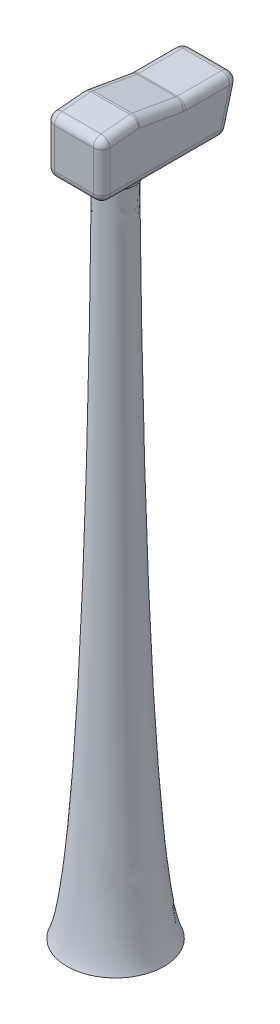
ISO-10303-21;
HEADER;
FILE_DESCRIPTION(('STEP AP214'),'2;1');
FILE_NAME('part.step','',(''),(''),'','','');
FILE_SCHEMA(('AUTOMOTIVE_DESIGN { 1 0 10303 214 1 1 1 1 }'));
ENDSEC;
DATA;
#1=APPLICATION_CONTEXT('core data for automotive mechanical design processes');
#2=APPLICATION_PROTOCOL_DEFINITION('international standard','automotive_design',2000,#1);
#3=PRODUCT_CONTEXT('',#1,'mechanical');
#4=PRODUCT('Part','Part','',(#3));
#5=PRODUCT_RELATED_PRODUCT_CATEGORY('part','',(#4));
#6=PRODUCT_DEFINITION_FORMATION('','',#4);
#7=PRODUCT_DEFINITION_CONTEXT('part definition',#1,'design');
#8=PRODUCT_DEFINITION('design','',#6,#7);
#9=PRODUCT_DEFINITION_SHAPE('','',#8);
#10=(LENGTH_UNIT() NAMED_UNIT(*) SI_UNIT(.MILLI.,.METRE.));
#11=(NAMED_UNIT(*) PLANE_ANGLE_UNIT() SI_UNIT($,.RADIAN.));
#12=(NAMED_UNIT(*) SI_UNIT($,.STERADIAN.) SOLID_ANGLE_UNIT());
#13=UNCERTAINTY_MEASURE_WITH_UNIT(LENGTH_MEASURE(1.E-05),#10,'distance_accuracy_value','');
#14=(GEOMETRIC_REPRESENTATION_CONTEXT(3) GLOBAL_UNCERTAINTY_ASSIGNED_CONTEXT((#13)) GLOBAL_UNIT_ASSIGNED_CONTEXT((#10,
#11,#12)) REPRESENTATION_CONTEXT('',''));
#15=CARTESIAN_POINT('',(0.,0.,0.));
#16=DIRECTION('',(0.,0.,1.));
#17=DIRECTION('',(1.,0.,0.));
#18=AXIS2_PLACEMENT_3D('',#15,#16,#17);
#19=CARTESIAN_POINT('',(-4000.,-4000.,-21041.644905921));
#20=DIRECTION('',(0.,1.,0.));
#21=DIRECTION('',(0.,0.,1.));
#22=AXIS2_PLACEMENT_3D('',#19,#20,#21);
#23=PLANE('',#22);
#24=DIRECTION('',(0.,0.,1.));
#25=VECTOR('',#24,1.);
#26=CARTESIAN_POINT('',(2800.,-4000.,-3000.));
#27=LINE('',#26,#25);
#28=CARTESIAN_POINT('',(2800.,-4000.,-20120.8525203462));
#29=VERTEX_POINT('',#28);
#30=CARTESIAN_POINT('',(2800.,-4000.,-9000.));
#31=VERTEX_POINT('',#30);
#32=EDGE_CURVE('E187',#29,#31,#27,.T.);
#33=ORIENTED_EDGE('',*,*,#32,.T.);
#34=CARTESIAN_POINT('',(0.,-4000.,-9000.));
#35=DIRECTION('',(0.,1.,0.));
#36=DIRECTION('',(0.,0.,1.));
#37=AXIS2_PLACEMENT_3D('',#34,#35,#36);
#38=CIRCLE('',#37,2800.);
#39=CARTESIAN_POINT('',(-2800.,-4000.,-9000.));
#40=VERTEX_POINT('',#39);
#41=EDGE_CURVE('E54',#31,#40,#38,.T.);
#42=ORIENTED_EDGE('',*,*,#41,.T.);
#43=DIRECTION('',(0.,0.,1.));
#44=VECTOR('',#43,1.);
#45=CARTESIAN_POINT('',(-2800.,-4000.,-21041.644905921));
#46=LINE('',#45,#44);
#47=CARTESIAN_POINT('',(-2800.,-4000.,-20120.8525203462));
#48=VERTEX_POINT('',#47);
#49=EDGE_CURVE('E184',#40,#48,#46,.F.);
#50=ORIENTED_EDGE('',*,*,#49,.T.);
#51=DIRECTION('',(1.,0.,0.));
#52=VECTOR('',#51,1.);
#53=CARTESIAN_POINT('',(-4000.,-4000.,-20120.8525203462));
#54=LINE('',#53,#52);
#55=EDGE_CURVE('E201',#48,#29,#54,.T.);
#56=ORIENTED_EDGE('',*,*,#55,.T.);
#57=EDGE_LOOP('',(#33,#42,#50,#56));
#58=FACE_BOUND('',#57,.T.);
#59=ADVANCED_FACE('F37',(#58),#23,.F.);
#60=CARTESIAN_POINT('',(-2800.,-4000.,-4200.));
#61=VERTEX_POINT('',#60);
#62=EDGE_CURVE('E195',#61,#40,#46,.F.);
#63=ORIENTED_EDGE('',*,*,#62,.T.);
#64=EDGE_CURVE('E173',#40,#31,#38,.T.);
#65=ORIENTED_EDGE('',*,*,#64,.T.);
#66=CARTESIAN_POINT('',(2800.,-4000.,-4200.));
#67=VERTEX_POINT('',#66);
#68=EDGE_CURVE('E460',#31,#67,#27,.T.);
#69=ORIENTED_EDGE('',*,*,#68,.T.);
#70=DIRECTION('',(1.,0.,0.));
#71=VECTOR('',#70,1.);
#72=CARTESIAN_POINT('',(-4000.,-4000.,-4200.));
#73=LINE('',#72,#71);
#74=EDGE_CURVE('E205',#67,#61,#73,.F.);
#75=ORIENTED_EDGE('',*,*,#74,.T.);
#76=EDGE_LOOP('',(#63,#65,#69,#75));
#77=FACE_BOUND('',#76,.T.);
#78=ADVANCED_FACE('F203',(#77),#23,.F.);
#79=CARTESIAN_POINT('',(-4000.,4000.,-3000.));
#80=DIRECTION('',(0.,-0.996194698091746,-0.0871557427476548));
#81=DIRECTION('',(0.,0.0871557427476548,-0.996194698091746));
#82=AXIS2_PLACEMENT_3D('',#79,#80,#81);
#83=PLANE('',#82);
#84=DIRECTION('',(1.,0.,0.));
#85=VECTOR('',#84,1.);
#86=CARTESIAN_POINT('',(-4000.,4458.66965758579,-8242.61817589548));
#87=LINE('',#86,#85);
#88=CARTESIAN_POINT('',(2800.,4458.66965758579,-8242.61817589548));
#89=VERTEX_POINT('',#88);
#90=CARTESIAN_POINT('',(-2800.,4458.66965758579,-8242.61817589548));
#91=VERTEX_POINT('',#90);
#92=EDGE_CURVE('E47',#89,#91,#87,.F.);
#93=ORIENTED_EDGE('',*,*,#92,.T.);
#94=DIRECTION('',(0.,0.0871557427476548,-0.996194698091746));
#95=VECTOR('',#94,1.);
#96=CARTESIAN_POINT('',(-2800.,4000.,-3000.));
#97=LINE('',#96,#95);
#98=CARTESIAN_POINT('',(-2800.,4095.83622888918,-4095.41310870281));
#99=VERTEX_POINT('',#98);
#100=EDGE_CURVE('E11',#91,#99,#97,.F.);
#101=ORIENTED_EDGE('',*,*,#100,.T.);
#102=DIRECTION('',(1.,0.,0.));
#103=VECTOR('',#102,1.);
#104=CARTESIAN_POINT('',(-4000.,4095.83622888918,-4095.41310870281));
#105=LINE('',#104,#103);
#106=CARTESIAN_POINT('',(2800.,4095.83622888918,-4095.41310870281));
#107=VERTEX_POINT('',#106);
#108=EDGE_CURVE('E298',#99,#107,#105,.T.);
#109=ORIENTED_EDGE('',*,*,#108,.T.);
#110=DIRECTION('',(0.,0.0871557427476548,-0.996194698091746));
#111=VECTOR('',#110,1.);
#112=CARTESIAN_POINT('',(2800.,4472.43878303997,-8400.));
#113=LINE('',#112,#111);
#114=EDGE_CURVE('E301',#107,#89,#113,.T.);
#115=ORIENTED_EDGE('',*,*,#114,.T.);
#116=EDGE_LOOP('',(#93,#101,#109,#115));
#117=FACE_BOUND('',#116,.T.);
#118=ADVANCED_FACE('F587',(#117),#83,.F.);
#119=CARTESIAN_POINT('',(-4000.,4472.43878303997,-8400.));
#120=DIRECTION('',(0.,-0.984807753012208,0.173648177666934));
#121=DIRECTION('',(0.,-0.173648177666934,-0.984807753012207));
#122=AXIS2_PLACEMENT_3D('',#119,#120,#121);
#123=PLANE('',#122);
#124=DIRECTION('',(1.,0.,0.));
#125=VECTOR('',#124,1.);
#126=CARTESIAN_POINT('',(-4000.,3326.91140674943,-14896.6085830308));
#127=LINE('',#126,#125);
#128=CARTESIAN_POINT('',(2800.,3326.91140674943,-14896.6085830308));
#129=VERTEX_POINT('',#128);
#130=CARTESIAN_POINT('',(-2800.,3326.91140674943,-14896.6085830308));
#131=VERTEX_POINT('',#130);
#132=EDGE_CURVE('E291',#129,#131,#127,.F.);
#133=ORIENTED_EDGE('',*,*,#132,.T.);
#134=DIRECTION('',(0.,-0.173648177666934,-0.984807753012207));
#135=VECTOR('',#134,1.);
#136=CARTESIAN_POINT('',(-2800.,4472.43878303997,-8400.));
#137=LINE('',#136,#135);
#138=CARTESIAN_POINT('',(-2800.,4445.00532349035,-8555.58288039299));
#139=VERTEX_POINT('',#138);
#140=EDGE_CURVE('E294',#131,#139,#137,.F.);
#141=ORIENTED_EDGE('',*,*,#140,.T.);
#142=DIRECTION('',(1.,0.,0.));
#143=VECTOR('',#142,1.);
#144=CARTESIAN_POINT('',(-4000.,4445.00532349035,-8555.58288039299));
#145=LINE('',#144,#143);
#146=CARTESIAN_POINT('',(2800.,4445.00532349035,-8555.58288039299));
#147=VERTEX_POINT('',#146);
#148=EDGE_CURVE('E285',#139,#147,#145,.T.);
#149=ORIENTED_EDGE('',*,*,#148,.T.);
#150=DIRECTION('',(0.,-0.173648177666934,-0.984807753012207));
#151=VECTOR('',#150,1.);
#152=CARTESIAN_POINT('',(2800.,3308.68071036408,-15000.));
#153=LINE('',#152,#151);
#154=EDGE_CURVE('E288',#147,#129,#153,.T.);
#155=ORIENTED_EDGE('',*,*,#154,.T.);
#156=EDGE_LOOP('',(#133,#141,#149,#155));
#157=FACE_BOUND('',#156,.T.);
#158=ADVANCED_FACE('F553',(#157),#123,.F.);
#159=CARTESIAN_POINT('',(-4000.,3308.68071036408,-15000.));
#160=DIRECTION('',(0.,-1.,0.));
#161=DIRECTION('',(0.,0.,-1.));
#162=AXIS2_PLACEMENT_3D('',#159,#160,#161);
#163=PLANE('',#162);
#164=DIRECTION('',(1.,0.,0.));
#165=VECTOR('',#164,1.);
#166=CARTESIAN_POINT('',(-4000.,3308.68071036408,-21436.1295525905));
#167=LINE('',#166,#165);
#168=CARTESIAN_POINT('',(2800.,3308.68071036408,-21436.1295525905));
#169=VERTEX_POINT('',#168);
#170=CARTESIAN_POINT('',(-2800.,3308.68071036408,-21436.1295525905));
#171=VERTEX_POINT('',#170);
#172=EDGE_CURVE('E278',#169,#171,#167,.F.);
#173=ORIENTED_EDGE('',*,*,#172,.T.);
#174=DIRECTION('',(0.,0.,-1.));
#175=VECTOR('',#174,1.);
#176=CARTESIAN_POINT('',(-2800.,3308.68071036408,-15000.));
#177=LINE('',#176,#175);
#178=CARTESIAN_POINT('',(-2800.,3308.68071036408,-15104.9863962311));
#179=VERTEX_POINT('',#178);
#180=EDGE_CURVE('E281',#171,#179,#177,.F.);
#181=ORIENTED_EDGE('',*,*,#180,.T.);
#182=DIRECTION('',(1.,0.,0.));
#183=VECTOR('',#182,1.);
#184=CARTESIAN_POINT('',(4000.,3308.68071036408,-15104.9863962311));
#185=LINE('',#184,#183);
#186=CARTESIAN_POINT('',(2800.,3308.68071036408,-15104.9863962311));
#187=VERTEX_POINT('',#186);
#188=EDGE_CURVE('E272',#179,#187,#185,.T.);
#189=ORIENTED_EDGE('',*,*,#188,.T.);
#190=DIRECTION('',(0.,0.,-1.));
#191=VECTOR('',#190,1.);
#192=CARTESIAN_POINT('',(2800.,3308.68071036408,-23000.));
#193=LINE('',#192,#191);
#194=EDGE_CURVE('E275',#187,#169,#193,.T.);
#195=ORIENTED_EDGE('',*,*,#194,.T.);
#196=EDGE_LOOP('',(#173,#181,#189,#195));
#197=FACE_BOUND('',#196,.T.);
#198=ADVANCED_FACE('F572',(#197),#163,.F.);
#199=CARTESIAN_POINT('',(-4000.,3308.68071036408,-23000.));
#200=DIRECTION('',(0.,0.258819045102524,0.965925826289068));
#201=DIRECTION('',(0.,-0.965925826289068,0.258819045102524));
#202=AXIS2_PLACEMENT_3D('',#199,#200,#201);
#203=PLANE('',#202);
#204=DIRECTION('',(1.,0.,0.));
#205=VECTOR('',#204,1.);
#206=CARTESIAN_POINT('',(-4000.,-3110.58285412303,-21279.9635118931));
#207=LINE('',#206,#205);
#208=CARTESIAN_POINT('',(2800.,-3110.58285412303,-21279.9635118931));
#209=VERTEX_POINT('',#208);
#210=CARTESIAN_POINT('',(-2800.,-3110.58285412303,-21279.9635118931));
#211=VERTEX_POINT('',#210);
#212=EDGE_CURVE('E242',#209,#211,#207,.F.);
#213=ORIENTED_EDGE('',*,*,#212,.T.);
#214=DIRECTION('',(0.,-0.965925826289068,0.258819045102524));
#215=VECTOR('',#214,1.);
#216=CARTESIAN_POINT('',(-2800.,3308.68071036408,-23000.));
#217=LINE('',#216,#215);
#218=CARTESIAN_POINT('',(-2800.,1798.09785624105,-22595.2405441374));
#219=VERTEX_POINT('',#218);
#220=EDGE_CURVE('E245',#211,#219,#217,.F.);
#221=ORIENTED_EDGE('',*,*,#220,.T.);
#222=DIRECTION('',(1.,0.,0.));
#223=VECTOR('',#222,1.);
#224=CARTESIAN_POINT('',(-4000.,1798.09785624105,-22595.2405441374));
#225=LINE('',#224,#223);
#226=CARTESIAN_POINT('',(2800.,1798.09785624105,-22595.2405441374));
#227=VERTEX_POINT('',#226);
#228=EDGE_CURVE('E237',#219,#227,#225,.T.);
#229=ORIENTED_EDGE('',*,*,#228,.T.);
#230=DIRECTION('',(0.,-0.965925826289068,0.258819045102524));
#231=VECTOR('',#230,1.);
#232=CARTESIAN_POINT('',(2800.,-4000.,-21041.644905921));
#233=LINE('',#232,#231);
#234=EDGE_CURVE('E240',#227,#209,#233,.T.);
#235=ORIENTED_EDGE('',*,*,#234,.T.);
#236=EDGE_LOOP('',(#213,#221,#229,#235));
#237=FACE_BOUND('',#236,.T.);
#238=ADVANCED_FACE('F570',(#237),#203,.F.);
#239=CARTESIAN_POINT('',(-4000.,-4000.,-3000.));
#240=DIRECTION('',(0.,0.,-1.));
#241=DIRECTION('',(-1.,0.,0.));
#242=AXIS2_PLACEMENT_3D('',#239,#240,#241);
#243=PLANE('',#242);
#244=DIRECTION('',(0.,1.,0.));
#245=VECTOR('',#244,1.);
#246=CARTESIAN_POINT('',(-2800.,-4000.,-3000.));
#247=LINE('',#246,#245);
#248=CARTESIAN_POINT('',(-2800.,2900.40259117909,-3000.));
#249=VERTEX_POINT('',#248);
#250=CARTESIAN_POINT('',(-2800.,-2800.,-3000.));
#251=VERTEX_POINT('',#250);
#252=EDGE_CURVE('E451',#249,#251,#247,.F.);
#253=ORIENTED_EDGE('',*,*,#252,.T.);
#254=DIRECTION('',(1.,0.,0.));
#255=VECTOR('',#254,1.);
#256=CARTESIAN_POINT('',(-4000.,-2800.,-3000.));
#257=LINE('',#256,#255);
#258=CARTESIAN_POINT('',(2800.,-2800.,-3000.));
#259=VERTEX_POINT('',#258);
#260=EDGE_CURVE('E457',#251,#259,#257,.T.);
#261=ORIENTED_EDGE('',*,*,#260,.T.);
#262=DIRECTION('',(0.,1.,0.));
#263=VECTOR('',#262,1.);
#264=CARTESIAN_POINT('',(2800.,4000.,-3000.));
#265=LINE('',#264,#263);
#266=CARTESIAN_POINT('',(2800.,2900.40259117909,-3000.));
#267=VERTEX_POINT('',#266);
#268=EDGE_CURVE('E445',#259,#267,#265,.T.);
#269=ORIENTED_EDGE('',*,*,#268,.T.);
#270=DIRECTION('',(1.,0.,0.));
#271=VECTOR('',#270,1.);
#272=CARTESIAN_POINT('',(-4000.,2900.40259117909,-3000.));
#273=LINE('',#272,#271);
#274=EDGE_CURVE('E438',#267,#249,#273,.F.);
#275=ORIENTED_EDGE('',*,*,#274,.T.);
#276=EDGE_LOOP('',(#253,#261,#269,#275));
#277=FACE_BOUND('',#276,.T.);
#278=ADVANCED_FACE('F482',(#277),#243,.F.);
#279=CARTESIAN_POINT('',(-4000.,0.,0.));
#280=DIRECTION('',(1.,0.,0.));
#281=DIRECTION('',(0.,0.,-1.));
#282=AXIS2_PLACEMENT_3D('',#279,#280,#281);
#283=PLANE('',#282);
#284=DIRECTION('',(0.,-0.965925826289068,0.258819045102524));
#285=VECTOR('',#284,1.);
#286=CARTESIAN_POINT('',(-4000.,-5217.77756478841,-19473.0109743831));
#287=LINE('',#286,#285);
#288=CARTESIAN_POINT('',(-4000.,2108.68071036408,-21436.1295525905));
#289=VERTEX_POINT('',#288);
#290=CARTESIAN_POINT('',(-4000.,-2800.,-20120.8525203462));
#291=VERTEX_POINT('',#290);
#292=EDGE_CURVE('E231',#289,#291,#287,.T.);
#293=ORIENTED_EDGE('',*,*,#292,.T.);
#294=DIRECTION('',(0.,0.,1.));
#295=VECTOR('',#294,1.);
#296=CARTESIAN_POINT('',(-4000.,-2800.,-4.135265251248E-13));
#297=LINE('',#296,#295);
#298=CARTESIAN_POINT('',(-4000.,-2800.,-4200.));
#299=VERTEX_POINT('',#298);
#300=EDGE_CURVE('E234',#291,#299,#297,.T.);
#301=ORIENTED_EDGE('',*,*,#300,.T.);
#302=DIRECTION('',(0.,1.,0.));
#303=VECTOR('',#302,1.);
#304=CARTESIAN_POINT('',(-4000.,0.,-4200.));
#305=LINE('',#304,#303);
#306=CARTESIAN_POINT('',(-4000.,2900.40259117909,-4200.));
#307=VERTEX_POINT('',#306);
#308=EDGE_CURVE('E220',#299,#307,#305,.T.);
#309=ORIENTED_EDGE('',*,*,#308,.T.);
#310=DIRECTION('',(0.,0.0871557427476548,-0.996194698091746));
#311=VECTOR('',#310,1.);
#312=CARTESIAN_POINT('',(-4000.,2513.70960181394,219.921093554975));
#313=LINE('',#312,#311);
#314=CARTESIAN_POINT('',(-4000.,3263.2360198757,-8347.20506719266));
#315=VERTEX_POINT('',#314);
#316=EDGE_CURVE('E210',#307,#315,#313,.T.);
#317=ORIENTED_EDGE('',*,*,#316,.T.);
#318=DIRECTION('',(0.,-0.173648177666934,-0.984807753012207));
#319=VECTOR('',#318,1.);
#320=CARTESIAN_POINT('',(-4000.,4592.29355054285,-809.745256294197));
#321=LINE('',#320,#319);
#322=CARTESIAN_POINT('',(-4000.,2145.14210313478,-14688.2307698305));
#323=VERTEX_POINT('',#322);
#324=EDGE_CURVE('E217',#315,#323,#321,.T.);
#325=ORIENTED_EDGE('',*,*,#324,.T.);
#326=CARTESIAN_POINT('',(-4000.,4508.68071036407,-15104.9863962311));
#327=DIRECTION('',(1.,0.,0.));
#328=DIRECTION('',(0.,0.,-1.));
#329=AXIS2_PLACEMENT_3D('',#326,#327,#328);
#330=CIRCLE('',#329,2400.);
#331=CARTESIAN_POINT('',(-4000.,2108.68071036408,-15104.9863962311));
#332=VERTEX_POINT('',#331);
#333=EDGE_CURVE('E224',#332,#323,#330,.F.);
#334=ORIENTED_EDGE('',*,*,#333,.F.);
#335=DIRECTION('',(0.,0.,-1.));
#336=VECTOR('',#335,1.);
#337=CARTESIAN_POINT('',(-4000.,2108.68071036407,1.17055293811456E-13));
#338=LINE('',#337,#336);
#339=EDGE_CURVE('E228',#332,#289,#338,.T.);
#340=ORIENTED_EDGE('',*,*,#339,.T.);
#341=EDGE_LOOP('',(#293,#301,#309,#317,#325,#334,#340));
#342=FACE_BOUND('',#341,.T.);
#343=ADVANCED_FACE('F491',(#342),#283,.F.);
#344=CARTESIAN_POINT('',(4000.,0.,0.));
#345=DIRECTION('',(1.,0.,0.));
#346=DIRECTION('',(0.,0.,-1.));
#347=AXIS2_PLACEMENT_3D('',#344,#345,#346);
#348=PLANE('',#347);
#349=DIRECTION('',(0.,0.,1.));
#350=VECTOR('',#349,1.);
#351=CARTESIAN_POINT('',(4000.,-2800.,-21041.644905921));
#352=LINE('',#351,#350);
#353=CARTESIAN_POINT('',(4000.,-2800.,-4200.));
#354=VERTEX_POINT('',#353);
#355=CARTESIAN_POINT('',(4000.,-2800.,-20120.8525203462));
#356=VERTEX_POINT('',#355);
#357=EDGE_CURVE('E265',#354,#356,#352,.F.);
#358=ORIENTED_EDGE('',*,*,#357,.T.);
#359=DIRECTION('',(0.,-0.965925826289068,0.258819045102524));
#360=VECTOR('',#359,1.);
#361=CARTESIAN_POINT('',(4000.,3619.2635644871,-21840.8890084531));
#362=LINE('',#361,#360);
#363=CARTESIAN_POINT('',(4000.,2108.68071036408,-21436.1295525905));
#364=VERTEX_POINT('',#363);
#365=EDGE_CURVE('E268',#356,#364,#362,.F.);
#366=ORIENTED_EDGE('',*,*,#365,.T.);
#367=DIRECTION('',(0.,0.,-1.));
#368=VECTOR('',#367,1.);
#369=CARTESIAN_POINT('',(4000.,2108.68071036408,-15000.));
#370=LINE('',#369,#368);
#371=CARTESIAN_POINT('',(4000.,2108.68071036408,-15104.9863962311));
#372=VERTEX_POINT('',#371);
#373=EDGE_CURVE('E259',#364,#372,#370,.F.);
#374=ORIENTED_EDGE('',*,*,#373,.T.);
#375=CARTESIAN_POINT('',(4000.,4508.68071036407,-15104.9863962311));
#376=DIRECTION('',(1.,0.,0.));
#377=DIRECTION('',(0.,0.,-1.));
#378=AXIS2_PLACEMENT_3D('',#375,#376,#377);
#379=CIRCLE('',#378,2400.);
#380=CARTESIAN_POINT('',(4000.,2145.14210313478,-14688.2307698305));
#381=VERTEX_POINT('',#380);
#382=EDGE_CURVE('E255',#381,#372,#379,.T.);
#383=ORIENTED_EDGE('',*,*,#382,.F.);
#384=DIRECTION('',(0.,-0.173648177666934,-0.984807753012207));
#385=VECTOR('',#384,1.);
#386=CARTESIAN_POINT('',(4000.,3290.66947942532,-8191.62218679968));
#387=LINE('',#386,#385);
#388=CARTESIAN_POINT('',(4000.,3263.2360198757,-8347.20506719267));
#389=VERTEX_POINT('',#388);
#390=EDGE_CURVE('E252',#381,#389,#387,.F.);
#391=ORIENTED_EDGE('',*,*,#390,.T.);
#392=DIRECTION('',(0.,0.0871557427476548,-0.996194698091746));
#393=VECTOR('',#392,1.);
#394=CARTESIAN_POINT('',(4000.,2804.5663622899,-3104.58689129719));
#395=LINE('',#394,#393);
#396=CARTESIAN_POINT('',(4000.,2900.40259117909,-4200.));
#397=VERTEX_POINT('',#396);
#398=EDGE_CURVE('E249',#389,#397,#395,.F.);
#399=ORIENTED_EDGE('',*,*,#398,.T.);
#400=DIRECTION('',(0.,1.,0.));
#401=VECTOR('',#400,1.);
#402=CARTESIAN_POINT('',(4000.,-4000.,-4200.));
#403=LINE('',#402,#401);
#404=EDGE_CURVE('E262',#397,#354,#403,.F.);
#405=ORIENTED_EDGE('',*,*,#404,.T.);
#406=EDGE_LOOP('',(#358,#366,#374,#383,#391,#399,#405));
#407=FACE_BOUND('',#406,.T.);
#408=ADVANCED_FACE('F516',(#407),#348,.T.);
#409=CARTESIAN_POINT('',(-4000.,4508.68071036407,-15104.9863962311));
#410=DIRECTION('',(-1.,0.,0.));
#411=DIRECTION('',(0.,0.,1.));
#412=AXIS2_PLACEMENT_3D('',#409,#410,#411);
#413=CYLINDRICAL_SURFACE('',#412,1200.);
#414=CARTESIAN_POINT('',(-2800.,4508.68071036407,-15104.9863962311));
#415=DIRECTION('',(1.,0.,0.));
#416=DIRECTION('',(0.,0.,-1.));
#417=AXIS2_PLACEMENT_3D('',#414,#415,#416);
#418=CIRCLE('',#417,1200.);
#419=EDGE_CURVE('E41',#131,#179,#418,.T.);
#420=ORIENTED_EDGE('',*,*,#419,.F.);
#421=ORIENTED_EDGE('',*,*,#132,.F.);
#422=CARTESIAN_POINT('',(2800.,4508.68071036407,-15104.9863962311));
#423=DIRECTION('',(1.,0.,0.));
#424=DIRECTION('',(0.,0.,-1.));
#425=AXIS2_PLACEMENT_3D('',#422,#423,#424);
#426=CIRCLE('',#425,1200.);
#427=EDGE_CURVE('E429',#187,#129,#426,.F.);
#428=ORIENTED_EDGE('',*,*,#427,.F.);
#429=ORIENTED_EDGE('',*,*,#188,.F.);
#430=EDGE_LOOP('',(#420,#421,#428,#429));
#431=FACE_BOUND('',#430,.T.);
#432=ADVANCED_FACE('F39',(#431),#413,.F.);
#433=CARTESIAN_POINT('',(-2800.,4508.68071036407,-15104.9863962311));
#434=DIRECTION('',(1.,0.,0.));
#435=DIRECTION('',(0.,0.,-1.));
#436=AXIS2_PLACEMENT_3D('',#433,#434,#435);
#437=TOROIDAL_SURFACE('',#436,2400.,1200.);
#438=CARTESIAN_POINT('',(-2800.,2145.14210313478,-14688.2307698305));
#439=DIRECTION('',(0.,-0.173648177666935,-0.984807753012207));
#440=DIRECTION('',(0.,0.984807753012207,-0.173648177666935));
#441=AXIS2_PLACEMENT_3D('',#438,#439,#440);
#442=CIRCLE('',#441,1200.);
#443=EDGE_CURVE('E423',#131,#323,#442,.F.);
#444=ORIENTED_EDGE('',*,*,#443,.F.);
#445=ORIENTED_EDGE('',*,*,#419,.T.);
#446=CARTESIAN_POINT('',(-2800.,2108.68071036408,-15104.9863962311));
#447=DIRECTION('',(0.,0.,1.));
#448=DIRECTION('',(1.,0.,0.));
#449=AXIS2_PLACEMENT_3D('',#446,#447,#448);
#450=CIRCLE('',#449,1200.);
#451=EDGE_CURVE('E427',#332,#179,#450,.F.);
#452=ORIENTED_EDGE('',*,*,#451,.F.);
#453=ORIENTED_EDGE('',*,*,#333,.T.);
#454=EDGE_LOOP('',(#444,#445,#452,#453));
#455=FACE_BOUND('',#454,.T.);
#456=ADVANCED_FACE('F556',(#455),#437,.T.);
#457=CARTESIAN_POINT('',(2800.,4508.68071036407,-15104.9863962311));
#458=DIRECTION('',(1.,0.,0.));
#459=DIRECTION('',(0.,0.,-1.));
#460=AXIS2_PLACEMENT_3D('',#457,#458,#459);
#461=TOROIDAL_SURFACE('',#460,2400.,1200.);
#462=CARTESIAN_POINT('',(2800.,2108.68071036408,-15104.9863962311));
#463=DIRECTION('',(0.,0.,1.));
#464=DIRECTION('',(1.,0.,0.));
#465=AXIS2_PLACEMENT_3D('',#462,#463,#464);
#466=CIRCLE('',#465,1200.);
#467=EDGE_CURVE('E415',#187,#372,#466,.F.);
#468=ORIENTED_EDGE('',*,*,#467,.F.);
#469=ORIENTED_EDGE('',*,*,#427,.T.);
#470=CARTESIAN_POINT('',(2800.,2145.14210313478,-14688.2307698305));
#471=DIRECTION('',(0.,-0.173648177666935,-0.984807753012207));
#472=DIRECTION('',(0.,0.984807753012207,-0.173648177666935));
#473=AXIS2_PLACEMENT_3D('',#470,#471,#472);
#474=CIRCLE('',#473,1200.);
#475=EDGE_CURVE('E419',#381,#129,#474,.F.);
#476=ORIENTED_EDGE('',*,*,#475,.F.);
#477=ORIENTED_EDGE('',*,*,#382,.T.);
#478=EDGE_LOOP('',(#468,#469,#476,#477));
#479=FACE_BOUND('',#478,.T.);
#480=ADVANCED_FACE('F656',(#479),#461,.T.);
#481=CARTESIAN_POINT('',(-2800.,2108.68071036407,1.17055293811456E-13));
#482=DIRECTION('',(0.,0.,-1.));
#483=DIRECTION('',(0.,1.,0.));
#484=AXIS2_PLACEMENT_3D('',#481,#482,#483);
#485=CYLINDRICAL_SURFACE('',#484,1200.);
#486=ORIENTED_EDGE('',*,*,#451,.T.);
#487=ORIENTED_EDGE('',*,*,#180,.F.);
#488=CARTESIAN_POINT('',(-2800.,2108.68071036408,-21436.1295525905));
#489=DIRECTION('',(0.,0.,-1.));
#490=DIRECTION('',(-1.,0.,0.));
#491=AXIS2_PLACEMENT_3D('',#488,#489,#490);
#492=CIRCLE('',#491,1200.);
#493=EDGE_CURVE('E407',#289,#171,#492,.T.);
#494=ORIENTED_EDGE('',*,*,#493,.F.);
#495=ORIENTED_EDGE('',*,*,#339,.F.);
#496=EDGE_LOOP('',(#486,#487,#494,#495));
#497=FACE_BOUND('',#496,.T.);
#498=ADVANCED_FACE('F559',(#497),#485,.T.);
#499=CARTESIAN_POINT('',(-2800.,4592.29355054285,-809.745256294197));
#500=DIRECTION('',(0.,-0.173648177666934,-0.984807753012207));
#501=DIRECTION('',(0.,0.984807753012208,-0.173648177666934));
#502=AXIS2_PLACEMENT_3D('',#499,#500,#501);
#503=CYLINDRICAL_SURFACE('',#502,1200.);
#504=ORIENTED_EDGE('',*,*,#443,.T.);
#505=ORIENTED_EDGE('',*,*,#324,.F.);
#506=CARTESIAN_POINT('',(-2800.,3263.2360198757,-8347.20506719267));
#507=DIRECTION('',(0.,0.173648177666935,0.984807753012207));
#508=DIRECTION('',(0.,-0.984807753012207,0.173648177666935));
#509=AXIS2_PLACEMENT_3D('',#506,#507,#508);
#510=CIRCLE('',#509,1200.);
#511=EDGE_CURVE('E403',#139,#315,#510,.T.);
#512=ORIENTED_EDGE('',*,*,#511,.F.);
#513=ORIENTED_EDGE('',*,*,#140,.F.);
#514=EDGE_LOOP('',(#504,#505,#512,#513));
#515=FACE_BOUND('',#514,.T.);
#516=ADVANCED_FACE('F543',(#515),#503,.T.);
#517=CARTESIAN_POINT('',(-4000.,3263.2360198757,-8347.20506719267));
#518=DIRECTION('',(1.,0.,0.));
#519=DIRECTION('',(0.,0.,-1.));
#520=AXIS2_PLACEMENT_3D('',#517,#518,#519);
#521=CYLINDRICAL_SURFACE('',#520,1200.);
#522=CARTESIAN_POINT('',(2800.,3263.2360198757,-8347.20506719267));
#523=DIRECTION('',(1.,0.,0.));
#524=DIRECTION('',(0.,0.,-1.));
#525=AXIS2_PLACEMENT_3D('',#522,#523,#524);
#526=CIRCLE('',#525,1200.);
#527=EDGE_CURVE('E396',#147,#89,#526,.T.);
#528=ORIENTED_EDGE('',*,*,#527,.F.);
#529=ORIENTED_EDGE('',*,*,#148,.F.);
#530=CARTESIAN_POINT('',(-2800.,3263.2360198757,-8347.20506719267));
#531=DIRECTION('',(-1.,0.,0.));
#532=DIRECTION('',(0.,0.,1.));
#533=AXIS2_PLACEMENT_3D('',#530,#531,#532);
#534=CIRCLE('',#533,1200.);
#535=EDGE_CURVE('E400',#91,#139,#534,.T.);
#536=ORIENTED_EDGE('',*,*,#535,.F.);
#537=ORIENTED_EDGE('',*,*,#92,.F.);
#538=EDGE_LOOP('',(#528,#529,#536,#537));
#539=FACE_BOUND('',#538,.T.);
#540=ADVANCED_FACE('F550',(#539),#521,.T.);
#541=CARTESIAN_POINT('',(2800.,3290.66947942532,-8191.62218679968));
#542=DIRECTION('',(0.,0.173648177666934,0.984807753012207));
#543=DIRECTION('',(0.,-0.984807753012208,0.173648177666934));
#544=AXIS2_PLACEMENT_3D('',#541,#542,#543);
#545=CYLINDRICAL_SURFACE('',#544,1200.);
#546=ORIENTED_EDGE('',*,*,#475,.T.);
#547=ORIENTED_EDGE('',*,*,#154,.F.);
#548=CARTESIAN_POINT('',(2800.,3263.2360198757,-8347.20506719267));
#549=DIRECTION('',(0.,0.173648177666935,0.984807753012207));
#550=DIRECTION('',(0.,-0.984807753012207,0.173648177666935));
#551=AXIS2_PLACEMENT_3D('',#548,#549,#550);
#552=CIRCLE('',#551,1200.);
#553=EDGE_CURVE('E392',#389,#147,#552,.T.);
#554=ORIENTED_EDGE('',*,*,#553,.F.);
#555=ORIENTED_EDGE('',*,*,#390,.F.);
#556=EDGE_LOOP('',(#546,#547,#554,#555));
#557=FACE_BOUND('',#556,.T.);
#558=ADVANCED_FACE('F676',(#557),#545,.T.);
#559=CARTESIAN_POINT('',(2800.,2108.68071036408,-15000.));
#560=DIRECTION('',(0.,0.,1.));
#561=DIRECTION('',(0.,-1.,0.));
#562=AXIS2_PLACEMENT_3D('',#559,#560,#561);
#563=CYLINDRICAL_SURFACE('',#562,1200.);
#564=ORIENTED_EDGE('',*,*,#467,.T.);
#565=ORIENTED_EDGE('',*,*,#373,.F.);
#566=CARTESIAN_POINT('',(2800.,2108.68071036408,-21436.1295525905));
#567=DIRECTION('',(0.,0.,-1.));
#568=DIRECTION('',(-1.,0.,0.));
#569=AXIS2_PLACEMENT_3D('',#566,#567,#568);
#570=CIRCLE('',#569,1200.);
#571=EDGE_CURVE('E388',#169,#364,#570,.T.);
#572=ORIENTED_EDGE('',*,*,#571,.F.);
#573=ORIENTED_EDGE('',*,*,#194,.F.);
#574=EDGE_LOOP('',(#564,#565,#572,#573));
#575=FACE_BOUND('',#574,.T.);
#576=ADVANCED_FACE('F682',(#575),#563,.T.);
#577=CARTESIAN_POINT('',(-4000.,2108.68071036408,-21436.1295525905));
#578=DIRECTION('',(1.,0.,0.));
#579=DIRECTION('',(0.,0.,-1.));
#580=AXIS2_PLACEMENT_3D('',#577,#578,#579);
#581=CYLINDRICAL_SURFACE('',#580,1200.);
#582=CARTESIAN_POINT('',(-2800.,2108.68071036408,-21436.1295525905));
#583=DIRECTION('',(-1.,0.,0.));
#584=DIRECTION('',(0.,0.,1.));
#585=AXIS2_PLACEMENT_3D('',#582,#583,#584);
#586=CIRCLE('',#585,1200.);
#587=EDGE_CURVE('E411',#171,#219,#586,.T.);
#588=ORIENTED_EDGE('',*,*,#587,.F.);
#589=ORIENTED_EDGE('',*,*,#172,.F.);
#590=CARTESIAN_POINT('',(2800.,2108.68071036408,-21436.1295525905));
#591=DIRECTION('',(1.,0.,0.));
#592=DIRECTION('',(0.,0.,-1.));
#593=AXIS2_PLACEMENT_3D('',#590,#591,#592);
#594=CIRCLE('',#593,1200.);
#595=EDGE_CURVE('E384',#227,#169,#594,.T.);
#596=ORIENTED_EDGE('',*,*,#595,.F.);
#597=ORIENTED_EDGE('',*,*,#228,.F.);
#598=EDGE_LOOP('',(#588,#589,#596,#597));
#599=FACE_BOUND('',#598,.T.);
#600=ADVANCED_FACE('F568',(#599),#581,.T.);
#601=CARTESIAN_POINT('',(-2800.,2108.68071036408,-21436.1295525905));
#602=DIRECTION('',(-1.,0.,0.));
#603=DIRECTION('',(0.,0.,1.));
#604=AXIS2_PLACEMENT_3D('',#601,#602,#603);
#605=SPHERICAL_SURFACE('',#604,1200.);
#606=ORIENTED_EDGE('',*,*,#493,.T.);
#607=ORIENTED_EDGE('',*,*,#587,.T.);
#608=CARTESIAN_POINT('',(-2800.,2108.68071036408,-21436.1295525905));
#609=DIRECTION('',(0.,0.965925826289068,-0.258819045102524));
#610=DIRECTION('',(0.,0.258819045102524,0.965925826289068));
#611=AXIS2_PLACEMENT_3D('',#608,#609,#610);
#612=CIRCLE('',#611,1200.);
#613=EDGE_CURVE('E381',#289,#219,#612,.F.);
#614=ORIENTED_EDGE('',*,*,#613,.F.);
#615=EDGE_LOOP('',(#606,#607,#614));
#616=FACE_BOUND('',#615,.T.);
#617=ADVANCED_FACE('F563',(#616),#605,.T.);
#618=CARTESIAN_POINT('',(-2800.,3263.2360198757,-8347.20506719267));
#619=DIRECTION('',(-1.,0.,0.));
#620=DIRECTION('',(0.,0.,1.));
#621=AXIS2_PLACEMENT_3D('',#618,#619,#620);
#622=SPHERICAL_SURFACE('',#621,1200.);
#623=ORIENTED_EDGE('',*,*,#535,.T.);
#624=ORIENTED_EDGE('',*,*,#511,.T.);
#625=CARTESIAN_POINT('',(-2800.,3263.2360198757,-8347.20506719266));
#626=DIRECTION('',(0.,0.087155742747654,-0.996194698091746));
#627=DIRECTION('',(0.,0.996194698091746,0.087155742747654));
#628=AXIS2_PLACEMENT_3D('',#625,#626,#627);
#629=CIRCLE('',#628,1200.);
#630=EDGE_CURVE('E377',#91,#315,#629,.F.);
#631=ORIENTED_EDGE('',*,*,#630,.F.);
#632=EDGE_LOOP('',(#623,#624,#631));
#633=FACE_BOUND('',#632,.T.);
#634=ADVANCED_FACE('F547',(#633),#622,.T.);
#635=CARTESIAN_POINT('',(2800.,3263.2360198757,-8347.20506719267));
#636=DIRECTION('',(1.,0.,0.));
#637=DIRECTION('',(0.,0.,-1.));
#638=AXIS2_PLACEMENT_3D('',#635,#636,#637);
#639=SPHERICAL_SURFACE('',#638,1200.);
#640=ORIENTED_EDGE('',*,*,#553,.T.);
#641=ORIENTED_EDGE('',*,*,#527,.T.);
#642=CARTESIAN_POINT('',(2800.,3263.2360198757,-8347.20506719267));
#643=DIRECTION('',(0.,0.0871557427476555,-0.996194698091746));
#644=DIRECTION('',(0.,0.996194698091746,0.0871557427476555));
#645=AXIS2_PLACEMENT_3D('',#642,#643,#644);
#646=CIRCLE('',#645,1200.);
#647=EDGE_CURVE('E373',#389,#89,#646,.F.);
#648=ORIENTED_EDGE('',*,*,#647,.F.);
#649=EDGE_LOOP('',(#640,#641,#648));
#650=FACE_BOUND('',#649,.T.);
#651=ADVANCED_FACE('F705',(#650),#639,.T.);
#652=CARTESIAN_POINT('',(2800.,2108.68071036408,-21436.1295525905));
#653=DIRECTION('',(1.,0.,0.));
#654=DIRECTION('',(0.,0.,-1.));
#655=AXIS2_PLACEMENT_3D('',#652,#653,#654);
#656=SPHERICAL_SURFACE('',#655,1200.);
#657=ORIENTED_EDGE('',*,*,#595,.T.);
#658=ORIENTED_EDGE('',*,*,#571,.T.);
#659=CARTESIAN_POINT('',(2800.,2108.68071036408,-21436.1295525905));
#660=DIRECTION('',(0.,0.965925826289067,-0.258819045102524));
#661=DIRECTION('',(0.,0.258819045102524,0.965925826289068));
#662=AXIS2_PLACEMENT_3D('',#659,#660,#661);
#663=CIRCLE('',#662,1200.);
#664=EDGE_CURVE('E370',#227,#364,#663,.F.);
#665=ORIENTED_EDGE('',*,*,#664,.F.);
#666=EDGE_LOOP('',(#657,#658,#665));
#667=FACE_BOUND('',#666,.T.);
#668=ADVANCED_FACE('F711',(#667),#656,.T.);
#669=CARTESIAN_POINT('',(-2800.,-5217.77756478841,-19473.0109743831));
#670=DIRECTION('',(0.,-0.965925826289068,0.258819045102524));
#671=DIRECTION('',(0.,-0.258819045102524,-0.965925826289068));
#672=AXIS2_PLACEMENT_3D('',#669,#670,#671);
#673=CYLINDRICAL_SURFACE('',#672,1200.);
#674=ORIENTED_EDGE('',*,*,#613,.T.);
#675=ORIENTED_EDGE('',*,*,#220,.F.);
#676=CARTESIAN_POINT('',(-2800.,-2800.,-20120.8525203462));
#677=DIRECTION('',(0.,-0.965925826289067,0.258819045102524));
#678=DIRECTION('',(0.,-0.258819045102524,-0.965925826289068));
#679=AXIS2_PLACEMENT_3D('',#676,#677,#678);
#680=CIRCLE('',#679,1200.);
#681=EDGE_CURVE('E362',#291,#211,#680,.T.);
#682=ORIENTED_EDGE('',*,*,#681,.F.);
#683=ORIENTED_EDGE('',*,*,#292,.F.);
#684=EDGE_LOOP('',(#674,#675,#682,#683));
#685=FACE_BOUND('',#684,.T.);
#686=ADVANCED_FACE('F498',(#685),#673,.T.);
#687=CARTESIAN_POINT('',(-2800.,2513.70960181394,219.921093554975));
#688=DIRECTION('',(0.,0.0871557427476548,-0.996194698091746));
#689=DIRECTION('',(0.,0.996194698091746,0.0871557427476548));
#690=AXIS2_PLACEMENT_3D('',#687,#688,#689);
#691=CYLINDRICAL_SURFACE('',#690,1200.);
#692=ORIENTED_EDGE('',*,*,#630,.T.);
#693=ORIENTED_EDGE('',*,*,#316,.F.);
#694=CARTESIAN_POINT('',(-2800.,2900.40259117909,-4200.));
#695=DIRECTION('',(0.,-0.0871557427476547,0.996194698091746));
#696=DIRECTION('',(0.,-0.996194698091746,-0.0871557427476547));
#697=AXIS2_PLACEMENT_3D('',#694,#695,#696);
#698=CIRCLE('',#697,1200.);
#699=EDGE_CURVE('E358',#99,#307,#698,.T.);
#700=ORIENTED_EDGE('',*,*,#699,.F.);
#701=ORIENTED_EDGE('',*,*,#100,.F.);
#702=EDGE_LOOP('',(#692,#693,#700,#701));
#703=FACE_BOUND('',#702,.T.);
#704=ADVANCED_FACE('F538',(#703),#691,.T.);
#705=CARTESIAN_POINT('',(-4000.,2900.40259117909,-4200.));
#706=DIRECTION('',(1.,0.,0.));
#707=DIRECTION('',(0.,0.,-1.));
#708=AXIS2_PLACEMENT_3D('',#705,#706,#707);
#709=CYLINDRICAL_SURFACE('',#708,1200.);
#710=CARTESIAN_POINT('',(2800.,2900.40259117909,-4200.));
#711=DIRECTION('',(1.,0.,0.));
#712=DIRECTION('',(0.,0.,-1.));
#713=AXIS2_PLACEMENT_3D('',#710,#711,#712);
#714=CIRCLE('',#713,1200.);
#715=EDGE_CURVE('E351',#107,#267,#714,.T.);
#716=ORIENTED_EDGE('',*,*,#715,.F.);
#717=ORIENTED_EDGE('',*,*,#108,.F.);
#718=CARTESIAN_POINT('',(-2800.,2900.40259117909,-4200.));
#719=DIRECTION('',(-1.,0.,0.));
#720=DIRECTION('',(0.,0.,1.));
#721=AXIS2_PLACEMENT_3D('',#718,#719,#720);
#722=CIRCLE('',#721,1200.);
#723=EDGE_CURVE('E355',#249,#99,#722,.T.);
#724=ORIENTED_EDGE('',*,*,#723,.F.);
#725=ORIENTED_EDGE('',*,*,#274,.F.);
#726=EDGE_LOOP('',(#716,#717,#724,#725));
#727=FACE_BOUND('',#726,.T.);
#728=ADVANCED_FACE('F530',(#727),#709,.T.);
#729=CARTESIAN_POINT('',(2800.,2804.5663622899,-3104.58689129719));
#730=DIRECTION('',(0.,-0.0871557427476548,0.996194698091746));
#731=DIRECTION('',(0.,-0.996194698091746,-0.0871557427476548));
#732=AXIS2_PLACEMENT_3D('',#729,#730,#731);
#733=CYLINDRICAL_SURFACE('',#732,1200.);
#734=ORIENTED_EDGE('',*,*,#647,.T.);
#735=ORIENTED_EDGE('',*,*,#114,.F.);
#736=CARTESIAN_POINT('',(2800.,2900.40259117909,-4200.));
#737=DIRECTION('',(0.,-0.0871557427476547,0.996194698091746));
#738=DIRECTION('',(0.,-0.996194698091746,-0.0871557427476547));
#739=AXIS2_PLACEMENT_3D('',#736,#737,#738);
#740=CIRCLE('',#739,1200.);
#741=EDGE_CURVE('E348',#397,#107,#740,.T.);
#742=ORIENTED_EDGE('',*,*,#741,.F.);
#743=ORIENTED_EDGE('',*,*,#398,.F.);
#744=EDGE_LOOP('',(#734,#735,#742,#743));
#745=FACE_BOUND('',#744,.T.);
#746=ADVANCED_FACE('F524',(#745),#733,.T.);
#747=CARTESIAN_POINT('',(2800.,3619.2635644871,-21840.8890084531));
#748=DIRECTION('',(0.,0.965925826289068,-0.258819045102524));
#749=DIRECTION('',(0.,0.258819045102524,0.965925826289068));
#750=AXIS2_PLACEMENT_3D('',#747,#748,#749);
#751=CYLINDRICAL_SURFACE('',#750,1200.);
#752=ORIENTED_EDGE('',*,*,#664,.T.);
#753=ORIENTED_EDGE('',*,*,#365,.F.);
#754=CARTESIAN_POINT('',(2800.,-2800.,-20120.8525203462));
#755=DIRECTION('',(0.,-0.965925826289068,0.258819045102524));
#756=DIRECTION('',(0.,-0.258819045102524,-0.965925826289068));
#757=AXIS2_PLACEMENT_3D('',#754,#755,#756);
#758=CIRCLE('',#757,1200.);
#759=EDGE_CURVE('E344',#209,#356,#758,.T.);
#760=ORIENTED_EDGE('',*,*,#759,.F.);
#761=ORIENTED_EDGE('',*,*,#234,.F.);
#762=EDGE_LOOP('',(#752,#753,#760,#761));
#763=FACE_BOUND('',#762,.T.);
#764=ADVANCED_FACE('F513',(#763),#751,.T.);
#765=CARTESIAN_POINT('',(-4000.,-2800.,-20120.8525203462));
#766=DIRECTION('',(1.,0.,0.));
#767=DIRECTION('',(0.,0.,-1.));
#768=AXIS2_PLACEMENT_3D('',#765,#766,#767);
#769=CYLINDRICAL_SURFACE('',#768,1200.);
#770=CARTESIAN_POINT('',(-2800.,-2800.,-20120.8525203462));
#771=DIRECTION('',(-1.,0.,0.));
#772=DIRECTION('',(0.,0.,1.));
#773=AXIS2_PLACEMENT_3D('',#770,#771,#772);
#774=CIRCLE('',#773,1200.);
#775=EDGE_CURVE('E366',#211,#48,#774,.T.);
#776=ORIENTED_EDGE('',*,*,#775,.F.);
#777=ORIENTED_EDGE('',*,*,#212,.F.);
#778=CARTESIAN_POINT('',(2800.,-2800.,-20120.8525203462));
#779=DIRECTION('',(1.,0.,0.));
#780=DIRECTION('',(0.,0.,-1.));
#781=AXIS2_PLACEMENT_3D('',#778,#779,#780);
#782=CIRCLE('',#781,1200.);
#783=EDGE_CURVE('E340',#29,#209,#782,.T.);
#784=ORIENTED_EDGE('',*,*,#783,.F.);
#785=ORIENTED_EDGE('',*,*,#55,.F.);
#786=EDGE_LOOP('',(#776,#777,#784,#785));
#787=FACE_BOUND('',#786,.T.);
#788=ADVANCED_FACE('F504',(#787),#769,.T.);
#789=CARTESIAN_POINT('',(-2800.,-2800.,-20120.8525203462));
#790=DIRECTION('',(-1.,0.,0.));
#791=DIRECTION('',(0.,0.,1.));
#792=AXIS2_PLACEMENT_3D('',#789,#790,#791);
#793=SPHERICAL_SURFACE('',#792,1200.);
#794=ORIENTED_EDGE('',*,*,#681,.T.);
#795=ORIENTED_EDGE('',*,*,#775,.T.);
#796=CARTESIAN_POINT('',(-2800.,-2800.,-20120.8525203462));
#797=DIRECTION('',(0.,0.,-1.));
#798=DIRECTION('',(-1.,0.,0.));
#799=AXIS2_PLACEMENT_3D('',#796,#797,#798);
#800=CIRCLE('',#799,1200.);
#801=EDGE_CURVE('E199',#291,#48,#800,.F.);
#802=ORIENTED_EDGE('',*,*,#801,.F.);
#803=EDGE_LOOP('',(#794,#795,#802));
#804=FACE_BOUND('',#803,.T.);
#805=ADVANCED_FACE('F501',(#804),#793,.T.);
#806=CARTESIAN_POINT('',(-2800.,2900.40259117909,-4200.));
#807=DIRECTION('',(-1.,0.,0.));
#808=DIRECTION('',(0.,0.,1.));
#809=AXIS2_PLACEMENT_3D('',#806,#807,#808);
#810=SPHERICAL_SURFACE('',#809,1200.);
#811=ORIENTED_EDGE('',*,*,#723,.T.);
#812=ORIENTED_EDGE('',*,*,#699,.T.);
#813=CARTESIAN_POINT('',(-2800.,2900.40259117909,-4200.));
#814=DIRECTION('',(0.,1.,0.));
#815=DIRECTION('',(0.,0.,1.));
#816=AXIS2_PLACEMENT_3D('',#813,#814,#815);
#817=CIRCLE('',#816,1200.);
#818=EDGE_CURVE('E335',#249,#307,#817,.F.);
#819=ORIENTED_EDGE('',*,*,#818,.F.);
#820=EDGE_LOOP('',(#811,#812,#819));
#821=FACE_BOUND('',#820,.T.);
#822=ADVANCED_FACE('F534',(#821),#810,.T.);
#823=CARTESIAN_POINT('',(2800.,2900.40259117909,-4200.));
#824=DIRECTION('',(1.,0.,0.));
#825=DIRECTION('',(0.,0.,-1.));
#826=AXIS2_PLACEMENT_3D('',#823,#824,#825);
#827=SPHERICAL_SURFACE('',#826,1200.);
#828=ORIENTED_EDGE('',*,*,#741,.T.);
#829=ORIENTED_EDGE('',*,*,#715,.T.);
#830=CARTESIAN_POINT('',(2800.,2900.40259117909,-4200.));
#831=DIRECTION('',(0.,1.,0.));
#832=DIRECTION('',(0.,0.,1.));
#833=AXIS2_PLACEMENT_3D('',#830,#831,#832);
#834=CIRCLE('',#833,1200.);
#835=EDGE_CURVE('E331',#397,#267,#834,.F.);
#836=ORIENTED_EDGE('',*,*,#835,.F.);
#837=EDGE_LOOP('',(#828,#829,#836));
#838=FACE_BOUND('',#837,.T.);
#839=ADVANCED_FACE('F527',(#838),#827,.T.);
#840=CARTESIAN_POINT('',(2800.,-2800.,-20120.8525203462));
#841=DIRECTION('',(1.,0.,0.));
#842=DIRECTION('',(0.,0.,-1.));
#843=AXIS2_PLACEMENT_3D('',#840,#841,#842);
#844=SPHERICAL_SURFACE('',#843,1200.);
#845=ORIENTED_EDGE('',*,*,#783,.T.);
#846=ORIENTED_EDGE('',*,*,#759,.T.);
#847=CARTESIAN_POINT('',(2800.,-2800.,-20120.8525203462));
#848=DIRECTION('',(0.,0.,-1.));
#849=DIRECTION('',(-1.,0.,0.));
#850=AXIS2_PLACEMENT_3D('',#847,#848,#849);
#851=CIRCLE('',#850,1200.);
#852=EDGE_CURVE('E327',#29,#356,#851,.F.);
#853=ORIENTED_EDGE('',*,*,#852,.F.);
#854=EDGE_LOOP('',(#845,#846,#853));
#855=FACE_BOUND('',#854,.T.);
#856=ADVANCED_FACE('F509',(#855),#844,.T.);
#857=CARTESIAN_POINT('',(-2800.,-2800.,-4.135265251248E-13));
#858=DIRECTION('',(0.,0.,1.));
#859=DIRECTION('',(0.,-1.,0.));
#860=AXIS2_PLACEMENT_3D('',#857,#858,#859);
#861=CYLINDRICAL_SURFACE('',#860,1200.);
#862=ORIENTED_EDGE('',*,*,#801,.T.);
#863=ORIENTED_EDGE('',*,*,#49,.F.);
#864=ORIENTED_EDGE('',*,*,#62,.F.);
#865=CARTESIAN_POINT('',(-2800.,-2800.,-4200.));
#866=DIRECTION('',(0.,0.,1.));
#867=DIRECTION('',(1.,0.,0.));
#868=AXIS2_PLACEMENT_3D('',#865,#866,#867);
#869=CIRCLE('',#868,1200.);
#870=EDGE_CURVE('E323',#299,#61,#869,.T.);
#871=ORIENTED_EDGE('',*,*,#870,.F.);
#872=ORIENTED_EDGE('',*,*,#300,.F.);
#873=EDGE_LOOP('',(#862,#863,#864,#871,#872));
#874=FACE_BOUND('',#873,.T.);
#875=ADVANCED_FACE('F193',(#874),#861,.T.);
#876=CARTESIAN_POINT('',(-2800.,0.,-4200.));
#877=DIRECTION('',(0.,1.,0.));
#878=DIRECTION('',(0.,0.,1.));
#879=AXIS2_PLACEMENT_3D('',#876,#877,#878);
#880=CYLINDRICAL_SURFACE('',#879,1200.);
#881=ORIENTED_EDGE('',*,*,#818,.T.);
#882=ORIENTED_EDGE('',*,*,#308,.F.);
#883=CARTESIAN_POINT('',(-2800.,-2800.,-4200.));
#884=DIRECTION('',(0.,-1.,0.));
#885=DIRECTION('',(0.,0.,-1.));
#886=AXIS2_PLACEMENT_3D('',#883,#884,#885);
#887=CIRCLE('',#886,1200.);
#888=EDGE_CURVE('E319',#251,#299,#887,.T.);
#889=ORIENTED_EDGE('',*,*,#888,.F.);
#890=ORIENTED_EDGE('',*,*,#252,.F.);
#891=EDGE_LOOP('',(#881,#882,#889,#890));
#892=FACE_BOUND('',#891,.T.);
#893=ADVANCED_FACE('F487',(#892),#880,.T.);
#894=CARTESIAN_POINT('',(2800.,-4000.,-4200.));
#895=DIRECTION('',(0.,-1.,0.));
#896=DIRECTION('',(0.,0.,-1.));
#897=AXIS2_PLACEMENT_3D('',#894,#895,#896);
#898=CYLINDRICAL_SURFACE('',#897,1200.);
#899=ORIENTED_EDGE('',*,*,#835,.T.);
#900=ORIENTED_EDGE('',*,*,#268,.F.);
#901=CARTESIAN_POINT('',(2800.,-2800.,-4200.));
#902=DIRECTION('',(0.,-1.,0.));
#903=DIRECTION('',(0.,0.,-1.));
#904=AXIS2_PLACEMENT_3D('',#901,#902,#903);
#905=CIRCLE('',#904,1200.);
#906=EDGE_CURVE('E315',#354,#259,#905,.T.);
#907=ORIENTED_EDGE('',*,*,#906,.F.);
#908=ORIENTED_EDGE('',*,*,#404,.F.);
#909=EDGE_LOOP('',(#899,#900,#907,#908));
#910=FACE_BOUND('',#909,.T.);
#911=ADVANCED_FACE('F480',(#910),#898,.T.);
#912=CARTESIAN_POINT('',(2800.,-2800.,-21041.644905921));
#913=DIRECTION('',(0.,0.,-1.));
#914=DIRECTION('',(0.,1.,0.));
#915=AXIS2_PLACEMENT_3D('',#912,#913,#914);
#916=CYLINDRICAL_SURFACE('',#915,1200.);
#917=ORIENTED_EDGE('',*,*,#852,.T.);
#918=ORIENTED_EDGE('',*,*,#357,.F.);
#919=CARTESIAN_POINT('',(2800.,-2800.,-4200.));
#920=DIRECTION('',(0.,0.,1.));
#921=DIRECTION('',(1.,0.,0.));
#922=AXIS2_PLACEMENT_3D('',#919,#920,#921);
#923=CIRCLE('',#922,1200.);
#924=EDGE_CURVE('E311',#67,#354,#923,.T.);
#925=ORIENTED_EDGE('',*,*,#924,.F.);
#926=ORIENTED_EDGE('',*,*,#68,.F.);
#927=ORIENTED_EDGE('',*,*,#32,.F.);
#928=EDGE_LOOP('',(#917,#918,#925,#926,#927));
#929=FACE_BOUND('',#928,.T.);
#930=ADVANCED_FACE('F468',(#929),#916,.T.);
#931=CARTESIAN_POINT('',(-2800.,-2800.,-4200.));
#932=DIRECTION('',(-1.,0.,0.));
#933=DIRECTION('',(0.,0.,1.));
#934=AXIS2_PLACEMENT_3D('',#931,#932,#933);
#935=SPHERICAL_SURFACE('',#934,1200.);
#936=ORIENTED_EDGE('',*,*,#888,.T.);
#937=ORIENTED_EDGE('',*,*,#870,.T.);
#938=CARTESIAN_POINT('',(-2800.,-2800.,-4200.));
#939=DIRECTION('',(-1.,0.,0.));
#940=DIRECTION('',(0.,0.,1.));
#941=AXIS2_PLACEMENT_3D('',#938,#939,#940);
#942=CIRCLE('',#941,1200.);
#943=EDGE_CURVE('E308',#251,#61,#942,.F.);
#944=ORIENTED_EDGE('',*,*,#943,.F.);
#945=EDGE_LOOP('',(#936,#937,#944));
#946=FACE_BOUND('',#945,.T.);
#947=ADVANCED_FACE('F489',(#946),#935,.T.);
#948=CARTESIAN_POINT('',(2800.,-2800.,-4200.));
#949=DIRECTION('',(1.,0.,0.));
#950=DIRECTION('',(0.,0.,-1.));
#951=AXIS2_PLACEMENT_3D('',#948,#949,#950);
#952=SPHERICAL_SURFACE('',#951,1200.);
#953=ORIENTED_EDGE('',*,*,#924,.T.);
#954=ORIENTED_EDGE('',*,*,#906,.T.);
#955=CARTESIAN_POINT('',(2800.,-2800.,-4200.));
#956=DIRECTION('',(1.,0.,0.));
#957=DIRECTION('',(0.,0.,-1.));
#958=AXIS2_PLACEMENT_3D('',#955,#956,#957);
#959=CIRCLE('',#958,1200.);
#960=EDGE_CURVE('E189',#67,#259,#959,.F.);
#961=ORIENTED_EDGE('',*,*,#960,.F.);
#962=EDGE_LOOP('',(#953,#954,#961));
#963=FACE_BOUND('',#962,.T.);
#964=ADVANCED_FACE('F476',(#963),#952,.T.);
#965=CARTESIAN_POINT('',(-4000.,-2800.,-4200.));
#966=DIRECTION('',(1.,0.,0.));
#967=DIRECTION('',(0.,0.,-1.));
#968=AXIS2_PLACEMENT_3D('',#965,#966,#967);
#969=CYLINDRICAL_SURFACE('',#968,1200.);
#970=ORIENTED_EDGE('',*,*,#943,.T.);
#971=ORIENTED_EDGE('',*,*,#74,.F.);
#972=ORIENTED_EDGE('',*,*,#960,.T.);
#973=ORIENTED_EDGE('',*,*,#260,.F.);
#974=EDGE_LOOP('',(#970,#971,#972,#973));
#975=FACE_BOUND('',#974,.T.);
#976=ADVANCED_FACE('F473',(#975),#969,.T.);
#977=CARTESIAN_POINT('',(0.,0.,-9000.));
#978=DIRECTION('',(0.,1.,0.));
#979=DIRECTION('',(0.,0.,1.));
#980=AXIS2_PLACEMENT_3D('',#977,#978,#979);
#981=CYLINDRICAL_SURFACE('',#980,2800.);
#982=CARTESIAN_POINT('',(0.,-4800.,-9000.));
#983=DIRECTION('',(0.,1.,0.));
#984=DIRECTION('',(0.,0.,1.));
#985=AXIS2_PLACEMENT_3D('',#982,#983,#984);
#986=CIRCLE('',#985,2800.);
#987=CARTESIAN_POINT('',(0.,-4800.,-6200.));
#988=VERTEX_POINT('',#987);
#989=EDGE_CURVE('E179',#988,#988,#986,.T.);
#990=ORIENTED_EDGE('',*,*,#989,.T.);
#991=EDGE_LOOP('',(#990));
#992=FACE_BOUND('',#991,.T.);
#993=ORIENTED_EDGE('',*,*,#41,.F.);
#994=ORIENTED_EDGE('',*,*,#64,.F.);
#995=EDGE_LOOP('',(#993,#994));
#996=FACE_BOUND('',#995,.T.);
#997=ADVANCED_FACE('F174',(#992,#996),#981,.T.);
#998=CARTESIAN_POINT('',(0.,-4800.,-6400.));
#999=DIRECTION('',(0.,-1.,0.));
#1000=DIRECTION('',(0.,0.,-1.));
#1001=AXIS2_PLACEMENT_3D('',#998,#999,#1000);
#1002=PLANE('',#1001);
#1003=CARTESIAN_POINT('',(0.,-4800.,-9000.));
#1004=DIRECTION('',(0.,1.,0.));
#1005=DIRECTION('',(0.,0.,1.));
#1006=AXIS2_PLACEMENT_3D('',#1003,#1004,#1005);
#1007=CIRCLE('',#1006,2600.);
#1008=CARTESIAN_POINT('',(0.,-4800.,-6400.));
#1009=VERTEX_POINT('',#1008);
#1010=EDGE_CURVE('E615',#1009,#1009,#1007,.T.);
#1011=ORIENTED_EDGE('',*,*,#1010,.T.);
#1012=EDGE_LOOP('',(#1011));
#1013=FACE_BOUND('',#1012,.T.);
#1014=ORIENTED_EDGE('',*,*,#989,.F.);
#1015=EDGE_LOOP('',(#1014));
#1016=FACE_BOUND('',#1015,.T.);
#1017=ADVANCED_FACE('F599',(#1013,#1016),#1002,.T.);
#1018=CARTESIAN_POINT('',(0.,0.,-9000.));
#1019=DIRECTION('',(0.,1.,0.));
#1020=DIRECTION('',(0.,0.,1.));
#1021=AXIS2_PLACEMENT_3D('',#1018,#1019,#1020);
#1022=CYLINDRICAL_SURFACE('',#1021,2600.);
#1023=CARTESIAN_POINT('',(0.,-4000.,-9000.));
#1024=DIRECTION('',(0.,1.,0.));
#1025=DIRECTION('',(0.,0.,1.));
#1026=AXIS2_PLACEMENT_3D('',#1023,#1024,#1025);
#1027=CIRCLE('',#1026,2600.);
#1028=CARTESIAN_POINT('',(0.,-4000.,-6400.));
#1029=VERTEX_POINT('',#1028);
#1030=EDGE_CURVE('E605',#1029,#1029,#1027,.T.);
#1031=ORIENTED_EDGE('',*,*,#1030,.T.);
#1032=EDGE_LOOP('',(#1031));
#1033=FACE_BOUND('',#1032,.T.);
#1034=ORIENTED_EDGE('',*,*,#1010,.F.);
#1035=EDGE_LOOP('',(#1034));
#1036=FACE_BOUND('',#1035,.T.);
#1037=ADVANCED_FACE('F590',(#1033,#1036),#1022,.F.);
#1038=ORIENTED_EDGE('',*,*,#1030,.F.);
#1039=EDGE_LOOP('',(#1038));
#1040=FACE_BOUND('',#1039,.T.);
#1041=CARTESIAN_POINT('',(0.,-4000.,-9000.));
#1042=DIRECTION('',(0.,1.,0.));
#1043=DIRECTION('',(0.,0.,1.));
#1044=AXIS2_PLACEMENT_3D('',#1041,#1042,#1043);
#1045=CIRCLE('',#1044,2480.);
#1046=CARTESIAN_POINT('',(0.,-4000.,-6520.));
#1047=VERTEX_POINT('',#1046);
#1048=EDGE_CURVE('E608',#1047,#1047,#1045,.T.);
#1049=ORIENTED_EDGE('',*,*,#1048,.T.);
#1050=EDGE_LOOP('',(#1049));
#1051=FACE_BOUND('',#1050,.T.);
#1052=ADVANCED_FACE('F583',(#1040,#1051),#23,.F.);
#1053=CARTESIAN_POINT('',(0.,-100000.,-9000.00000000001));
#1054=DIRECTION('',(0.,-1.,0.));
#1055=DIRECTION('',(0.,0.,-1.));
#1056=AXIS2_PLACEMENT_3D('',#1053,#1054,#1055);
#1057=PLANE('',#1056);
#1058=CARTESIAN_POINT('',(0.,-100000.,-9000.00000000001));
#1059=DIRECTION('',(0.,1.,0.));
#1060=DIRECTION('',(0.,0.,1.));
#1061=AXIS2_PLACEMENT_3D('',#1058,#1059,#1060);
#1062=CIRCLE('',#1061,7000.);
#1063=CARTESIAN_POINT('',(0.,-100000.,-2000.00000000001));
#1064=VERTEX_POINT('',#1063);
#1065=EDGE_CURVE('E618',#1064,#1064,#1062,.T.);
#1066=ORIENTED_EDGE('',*,*,#1065,.F.);
#1067=EDGE_LOOP('',(#1066));
#1068=FACE_BOUND('',#1067,.T.);
#1069=ADVANCED_FACE('F589',(#1068),#1057,.T.);
#1070=CARTESIAN_POINT('',(0.,-4800.,-6520.));
#1071=CARTESIAN_POINT('',(0.,-5632.50480368667,-6520.));
#1072=CARTESIAN_POINT('',(0.,-90939.9063825468,-6182.47837642611));
#1073=CARTESIAN_POINT('',(0.,-100000.,-2000.00000000001));
#1074=B_SPLINE_CURVE_WITH_KNOTS('',3,(#1070,#1071,#1072,#1073),.UNSPECIFIED.,.F.,.F.,(4,4),(0.,
1.),.UNSPECIFIED.);
#1075=CARTESIAN_POINT('',(0.,0.,-9000.));
#1076=DIRECTION('',(0.,1.,0.));
#1077=AXIS1_PLACEMENT('',#1075,#1076);
#1078=SURFACE_OF_REVOLUTION('',#1074,#1077);
#1079=ORIENTED_EDGE('',*,*,#1065,.T.);
#1080=EDGE_LOOP('',(#1079));
#1081=FACE_BOUND('',#1080,.T.);
#1082=CARTESIAN_POINT('',(0.,-4800.,-9000.));
#1083=DIRECTION('',(0.,1.,0.));
#1084=DIRECTION('',(0.,0.,1.));
#1085=AXIS2_PLACEMENT_3D('',#1082,#1083,#1084);
#1086=CIRCLE('',#1085,2480.);
#1087=CARTESIAN_POINT('',(0.,-4800.,-6520.));
#1088=VERTEX_POINT('',#1087);
#1089=EDGE_CURVE('E611',#1088,#1088,#1086,.T.);
#1090=ORIENTED_EDGE('',*,*,#1089,.F.);
#1091=EDGE_LOOP('',(#1090));
#1092=FACE_BOUND('',#1091,.T.);
#1093=ADVANCED_FACE('F596',(#1081,#1092),#1078,.F.);
#1094=CARTESIAN_POINT('',(0.,0.,-9000.));
#1095=DIRECTION('',(0.,1.,0.));
#1096=DIRECTION('',(0.,0.,1.));
#1097=AXIS2_PLACEMENT_3D('',#1094,#1095,#1096);
#1098=CYLINDRICAL_SURFACE('',#1097,2480.);
#1099=ORIENTED_EDGE('',*,*,#1089,.T.);
#1100=EDGE_LOOP('',(#1099));
#1101=FACE_BOUND('',#1100,.T.);
#1102=ORIENTED_EDGE('',*,*,#1048,.F.);
#1103=EDGE_LOOP('',(#1102));
#1104=FACE_BOUND('',#1103,.T.);
#1105=ADVANCED_FACE('F830',(#1101,#1104),#1098,.T.);
#1106=CLOSED_SHELL('',(#59,#78,#118,#158,#198,#238,#278,#343,#408,#432,#456,#480,#498,#516,#540,
#558,#576,#600,#617,#634,#651,#668,#686,#704,#728,#746,#764,#788,#805,#822,#839,#856,#875,#893,
#911,#930,#947,#964,#976,#997,#1017,#1037,#1052,#1069,#1093,#1105));
#1107=MANIFOLD_SOLID_BREP('B2',#1106);
#1108=ADVANCED_BREP_SHAPE_REPRESENTATION('',(#18,#1107),#14);
#1109=SHAPE_DEFINITION_REPRESENTATION(#9,#1108);
ENDSEC;
END-ISO-10303-21;
